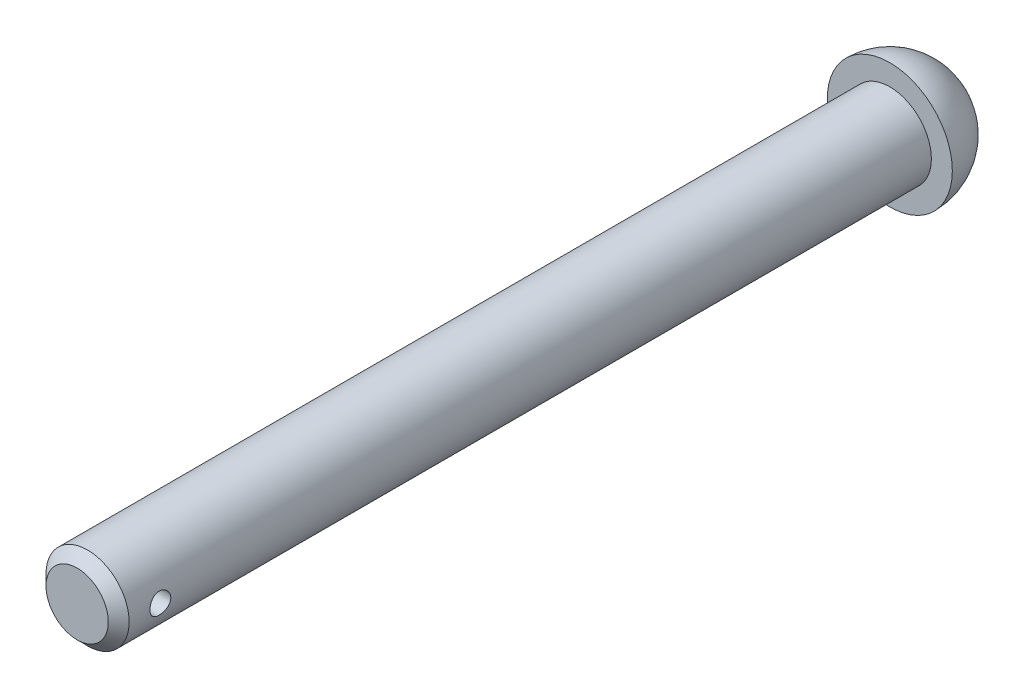
ISO-10303-21;
HEADER;
FILE_DESCRIPTION(('STEP AP214'),'2;1');
FILE_NAME('part.step','',(''),(''),'','','');
FILE_SCHEMA(('AUTOMOTIVE_DESIGN { 1 0 10303 214 1 1 1 1 }'));
ENDSEC;
DATA;
#1=APPLICATION_CONTEXT('core data for automotive mechanical design processes');
#2=APPLICATION_PROTOCOL_DEFINITION('international standard','automotive_design',2000,#1);
#3=PRODUCT_CONTEXT('',#1,'mechanical');
#4=PRODUCT('Part','Part','',(#3));
#5=PRODUCT_RELATED_PRODUCT_CATEGORY('part','',(#4));
#6=PRODUCT_DEFINITION_FORMATION('','',#4);
#7=PRODUCT_DEFINITION_CONTEXT('part definition',#1,'design');
#8=PRODUCT_DEFINITION('design','',#6,#7);
#9=PRODUCT_DEFINITION_SHAPE('','',#8);
#10=(LENGTH_UNIT() NAMED_UNIT(*) SI_UNIT(.MILLI.,.METRE.));
#11=(NAMED_UNIT(*) PLANE_ANGLE_UNIT() SI_UNIT($,.RADIAN.));
#12=(NAMED_UNIT(*) SI_UNIT($,.STERADIAN.) SOLID_ANGLE_UNIT());
#13=UNCERTAINTY_MEASURE_WITH_UNIT(LENGTH_MEASURE(1.E-05),#10,'distance_accuracy_value','');
#14=(GEOMETRIC_REPRESENTATION_CONTEXT(3) GLOBAL_UNCERTAINTY_ASSIGNED_CONTEXT((#13)) GLOBAL_UNIT_ASSIGNED_CONTEXT((#10,
#11,#12)) REPRESENTATION_CONTEXT('',''));
#15=CARTESIAN_POINT('',(0.,0.,0.));
#16=DIRECTION('',(0.,0.,1.));
#17=DIRECTION('',(1.,0.,0.));
#18=AXIS2_PLACEMENT_3D('',#15,#16,#17);
#19=CARTESIAN_POINT('',(0.,1.9945945945946,0.));
#20=DIRECTION('',(0.,0.,-1.));
#21=DIRECTION('',(-1.,0.,0.));
#22=AXIS2_PLACEMENT_3D('',#19,#20,#21);
#23=PLANE('',#22);
#24=CARTESIAN_POINT('',(0.,0.,0.));
#25=DIRECTION('',(0.,0.,-1.));
#26=DIRECTION('',(-1.,0.,0.));
#27=AXIS2_PLACEMENT_3D('',#24,#25,#26);
#28=CIRCLE('',#27,1.49459459459459);
#29=CARTESIAN_POINT('',(-1.49459459459459,0.,0.));
#30=VERTEX_POINT('',#29);
#31=EDGE_CURVE('E38',#30,#30,#28,.F.);
#32=ORIENTED_EDGE('',*,*,#31,.T.);
#33=EDGE_LOOP('',(#32));
#34=FACE_BOUND('',#33,.T.);
#35=ADVANCED_FACE('F31',(#34),#23,.F.);
#36=CARTESIAN_POINT('',(0.,0.,0.));
#37=DIRECTION('',(0.,0.,1.));
#38=DIRECTION('',(1.,0.,0.));
#39=AXIS2_PLACEMENT_3D('',#36,#37,#38);
#40=CYLINDRICAL_SURFACE('',#39,1.9945945945946);
#41=CARTESIAN_POINT('',(0.,0.,-0.500000000000001));
#42=DIRECTION('',(0.,0.,-1.));
#43=DIRECTION('',(-1.,0.,0.));
#44=AXIS2_PLACEMENT_3D('',#41,#42,#43);
#45=CIRCLE('',#44,1.9945945945946);
#46=CARTESIAN_POINT('',(-1.9945945945946,0.,-0.500000000000001));
#47=VERTEX_POINT('',#46);
#48=EDGE_CURVE('E10',#47,#47,#45,.T.);
#49=ORIENTED_EDGE('',*,*,#48,.T.);
#50=EDGE_LOOP('',(#49));
#51=FACE_BOUND('',#50,.T.);
#52=CARTESIAN_POINT('',(1.9945945945946,0.,-2.50000000000001));
#53=CARTESIAN_POINT('',(1.99459412916602,-0.0276229243003891,-2.49999922923164));
#54=CARTESIAN_POINT('',(1.9940150601518,-0.0552544440206031,-2.49770322284521));
#55=CARTESIAN_POINT('',(1.99176115519341,-0.109725403131875,-2.4885937156492));
#56=CARTESIAN_POINT('',(1.9900857019167,-0.136564387372876,-2.48177766974727));
#57=CARTESIAN_POINT('',(1.98582453446624,-0.188655814007178,-2.46386064468975));
#58=CARTESIAN_POINT('',(1.98323991692116,-0.213910124770515,-2.45276482622166));
#59=CARTESIAN_POINT('',(1.97743560069731,-0.262198929308613,-2.42662141920469));
#60=CARTESIAN_POINT('',(1.97421587975519,-0.285233345223514,-2.41157369211677));
#61=CARTESIAN_POINT('',(1.96741630806606,-0.328905296646371,-2.37762462668088));
#62=CARTESIAN_POINT('',(1.96383087704529,-0.349490338649994,-2.35865687525255));
#63=CARTESIAN_POINT('',(1.95674100959017,-0.387222949714277,-2.31754836783185));
#64=CARTESIAN_POINT('',(1.95323658238955,-0.404370128580711,-2.29540725215413));
#65=CARTESIAN_POINT('',(1.94664921340626,-0.434987510122619,-2.24817247724769));
#66=CARTESIAN_POINT('',(1.94357335408304,-0.44839892545552,-2.22303963477457));
#67=CARTESIAN_POINT('',(1.93827278632662,-0.470786001715847,-2.17078655756022));
#68=CARTESIAN_POINT('',(1.93604794101707,-0.479762376039138,-2.14366664325468));
#69=CARTESIAN_POINT('',(1.93275866869361,-0.492845357985552,-2.08878663398759));
#70=CARTESIAN_POINT('',(1.93167177822492,-0.49704638096564,-2.06105042465896));
#71=CARTESIAN_POINT('',(1.93071424252683,-0.500753507696852,-2.00524725457057));
#72=CARTESIAN_POINT('',(1.93084339828345,-0.500260379676538,-1.97718034868236));
#73=CARTESIAN_POINT('',(1.93228317323515,-0.494668517696636,-1.9222366487033));
#74=CARTESIAN_POINT('',(1.93356491201462,-0.48968235983675,-1.89534752215308));
#75=CARTESIAN_POINT('',(1.93711939899412,-0.47542558911305,-1.84280013988248));
#76=CARTESIAN_POINT('',(1.93939221813484,-0.466154669546769,-1.81714197241908));
#77=CARTESIAN_POINT('',(1.94469924078358,-0.443495771600234,-1.76748331336249));
#78=CARTESIAN_POINT('',(1.94774093251608,-0.430066991360872,-1.74350227326373));
#79=CARTESIAN_POINT('',(1.95423875875304,-0.399502099243961,-1.69809364006625));
#80=CARTESIAN_POINT('',(1.95769496609402,-0.382365335392258,-1.67666649704768));
#81=CARTESIAN_POINT('',(1.96475394163776,-0.344288093247245,-1.63632884427759));
#82=CARTESIAN_POINT('',(1.96835807057655,-0.323252633655316,-1.61750811835391));
#83=CARTESIAN_POINT('',(1.9752174434422,-0.278280867045495,-1.5836443069893));
#84=CARTESIAN_POINT('',(1.97847267659617,-0.254344470503571,-1.56860133817546));
#85=CARTESIAN_POINT('',(1.98428382703446,-0.204121757216062,-1.54268682653742));
#86=CARTESIAN_POINT('',(1.98683727954726,-0.177827577640995,-1.53182993347024));
#87=CARTESIAN_POINT('',(1.99093924187059,-0.12370904259099,-1.51471547044262));
#88=CARTESIAN_POINT('',(1.9924879449804,-0.0958849825609624,-1.50845701577826));
#89=CARTESIAN_POINT('',(1.99437728203376,-0.0402640921406006,-1.50085435538753));
#90=CARTESIAN_POINT('',(1.99474796435106,-0.0124849691870178,-1.49938788984704));
#91=CARTESIAN_POINT('',(1.99432510926712,0.0429217973701125,-1.50107541772257));
#92=CARTESIAN_POINT('',(1.99353167727241,0.0705494544610229,-1.50422899280981));
#93=CARTESIAN_POINT('',(1.99088900641486,0.124443740657923,-1.51496632880956));
#94=CARTESIAN_POINT('',(1.98905568647708,0.15072452106727,-1.52248333266533));
#95=CARTESIAN_POINT('',(1.98453993017485,0.201650652157164,-1.54165784393325));
#96=CARTESIAN_POINT('',(1.98185740779231,0.226295836857633,-1.55331577080561));
#97=CARTESIAN_POINT('',(1.97586890691978,0.273737166379977,-1.58067774464301));
#98=CARTESIAN_POINT('',(1.97255267034549,0.29649253549461,-1.59645019103822));
#99=CARTESIAN_POINT('',(1.96568067237855,0.33907691453299,-1.6315061092407));
#100=CARTESIAN_POINT('',(1.9621248694796,0.358905415450493,-1.65079019045044));
#101=CARTESIAN_POINT('',(1.95506624210939,0.395577470306682,-1.69288974284238));
#102=CARTESIAN_POINT('',(1.95156689306674,0.412335242210465,-1.71578064614613));
#103=CARTESIAN_POINT('',(1.94511527229302,0.441771595189007,-1.7641217569349));
#104=CARTESIAN_POINT('',(1.9421629763113,0.454450357103006,-1.78957185089483));
#105=CARTESIAN_POINT('',(1.93717232977737,0.475274314480221,-1.84217271289303));
#106=CARTESIAN_POINT('',(1.93512857976061,0.483446365000588,-1.86931231025619));
#107=CARTESIAN_POINT('',(1.93218138002976,0.495095440547508,-1.92463930958524));
#108=CARTESIAN_POINT('',(1.93127767932133,0.498573499019603,-1.95282647950926));
#109=CARTESIAN_POINT('',(1.93073210310839,0.500681643389609,-2.00857536485468));
#110=CARTESIAN_POINT('',(1.93105453279858,0.499448864848939,-2.03613162794188));
#111=CARTESIAN_POINT('',(1.93284231857926,0.492484354546481,-2.09062991300037));
#112=CARTESIAN_POINT('',(1.93430765145904,0.486752714150017,-2.11757194743432));
#113=CARTESIAN_POINT('',(1.93819618877685,0.47102826572168,-2.16992695535936));
#114=CARTESIAN_POINT('',(1.94061357526406,0.461061310799122,-2.19534815550514));
#115=CARTESIAN_POINT('',(1.94613463133654,0.437169598358069,-2.24417571632294));
#116=CARTESIAN_POINT('',(1.94923839660508,0.423244288955783,-2.26758179544841));
#117=CARTESIAN_POINT('',(1.95588417437892,0.391401788504877,-2.31237705921779));
#118=CARTESIAN_POINT('',(1.95943554379176,0.373389505375761,-2.33369727103976));
#119=CARTESIAN_POINT('',(1.96652066493811,0.334069492676488,-2.37305711779535));
#120=CARTESIAN_POINT('',(1.97005441228448,0.312760981008558,-2.39109597194361));
#121=CARTESIAN_POINT('',(1.97678303683404,0.266984383956085,-2.42370189770922));
#122=CARTESIAN_POINT('',(1.97997055913109,0.242465766173402,-2.43819965801994));
#123=CARTESIAN_POINT('',(1.98556988135218,0.191261574034837,-2.46284451169936));
#124=CARTESIAN_POINT('',(1.98798223455119,0.164577562338431,-2.47299470986001));
#125=CARTESIAN_POINT('',(1.99140453947636,0.114952672366669,-2.48715684519178));
#126=CARTESIAN_POINT('',(1.99259257329145,0.0922473260885578,-2.49196258750016));
#127=CARTESIAN_POINT('',(1.99418776647771,0.0463633141908546,-2.49838436706433));
#128=CARTESIAN_POINT('',(1.99459498524167,0.023184684707163,-2.50000064692722));
#129=CARTESIAN_POINT('',(1.9945945945946,0.,-2.50000000000001));
#130=B_SPLINE_CURVE_WITH_KNOTS('',3,(#52,#53,#54,#55,#56,#57,#58,#59,#60,#61,#62,#63,#64,#65,
#66,#67,#68,#69,#70,#71,#72,#73,#74,#75,#76,#77,#78,#79,#80,#81,#82,#83,#84,#85,#86,#87,#88,#89,
#90,#91,#92,#93,#94,#95,#96,#97,#98,#99,#100,#101,#102,#103,#104,#105,#106,#107,#108,#109,#110,
#111,#112,#113,#114,#115,#116,#117,#118,#119,#120,#121,#122,#123,#124,#125,#126,#127,#128,#129),
.UNSPECIFIED.,.T.,.F.,(4,2,2,2,2,2,2,2,2,2,2,2,2,2,2,2,2,2,2,2,2,2,2,2,2,2,2,2,2,2,2,2,2,2,2,2,
2,2,4),(0.,0.0827838071128275,0.165614266812049,0.248345157560955,0.331078948930654,
0.415350127651107,0.49963086566302,0.585171281079084,0.670697932459611,0.754502470752652,
0.838293294119821,0.920041327631844,1.00179521355979,1.08437825274479,1.16697582430877,
1.25194189843887,1.33691059532274,1.42217400994035,1.50742101623923,1.59047536902927,
1.67352220199785,1.7553307714284,1.83714763012937,1.92042245562462,2.0037117462716,
2.0890573721243,2.17439921373385,2.25922685971629,2.3440358267022,2.42639501790788,
2.50875253656175,2.59061439298552,2.67248766839913,2.75650762174471,2.84054754121073,
2.92612003358533,3.01163131244361,3.08111933825229,3.15060207823657),.UNSPECIFIED.);
#131=CARTESIAN_POINT('',(1.9945945945946,0.,-2.50000000000001));
#132=VERTEX_POINT('',#131);
#133=EDGE_CURVE('E49',#132,#132,#130,.T.);
#134=ORIENTED_EDGE('',*,*,#133,.T.);
#135=EDGE_LOOP('',(#134));
#136=FACE_BOUND('',#135,.T.);
#137=CARTESIAN_POINT('',(-1.9945945945946,0.,-2.50000000000001));
#138=CARTESIAN_POINT('',(-1.99459412916602,0.0276229243003891,-2.49999922923164));
#139=CARTESIAN_POINT('',(-1.9940150601518,0.0552544440206031,-2.49770322284521));
#140=CARTESIAN_POINT('',(-1.99176115519341,0.109725403131875,-2.4885937156492));
#141=CARTESIAN_POINT('',(-1.9900857019167,0.136564387372876,-2.48177766974727));
#142=CARTESIAN_POINT('',(-1.98582453446624,0.188655814007178,-2.46386064468975));
#143=CARTESIAN_POINT('',(-1.98323991692116,0.213910124770515,-2.45276482622166));
#144=CARTESIAN_POINT('',(-1.97743560069731,0.262198929308613,-2.42662141920469));
#145=CARTESIAN_POINT('',(-1.97421587975519,0.285233345223514,-2.41157369211677));
#146=CARTESIAN_POINT('',(-1.96741630806606,0.328905296646371,-2.37762462668088));
#147=CARTESIAN_POINT('',(-1.96383087704529,0.349490338649994,-2.35865687525255));
#148=CARTESIAN_POINT('',(-1.95674100959017,0.387222949714277,-2.31754836783185));
#149=CARTESIAN_POINT('',(-1.95323658238955,0.404370128580711,-2.29540725215413));
#150=CARTESIAN_POINT('',(-1.94664921340626,0.434987510122619,-2.24817247724769));
#151=CARTESIAN_POINT('',(-1.94357335408304,0.44839892545552,-2.22303963477457));
#152=CARTESIAN_POINT('',(-1.93827278632662,0.470786001715847,-2.17078655756022));
#153=CARTESIAN_POINT('',(-1.93604794101707,0.479762376039138,-2.14366664325468));
#154=CARTESIAN_POINT('',(-1.93275866869361,0.492845357985552,-2.08878663398759));
#155=CARTESIAN_POINT('',(-1.93167177822492,0.49704638096564,-2.06105042465896));
#156=CARTESIAN_POINT('',(-1.93071424252683,0.500753507696852,-2.00524725457057));
#157=CARTESIAN_POINT('',(-1.93084339828345,0.500260379676538,-1.97718034868236));
#158=CARTESIAN_POINT('',(-1.93228317323515,0.494668517696636,-1.9222366487033));
#159=CARTESIAN_POINT('',(-1.93356491201462,0.48968235983675,-1.89534752215308));
#160=CARTESIAN_POINT('',(-1.93711939899412,0.47542558911305,-1.84280013988248));
#161=CARTESIAN_POINT('',(-1.93939221813484,0.466154669546769,-1.81714197241908));
#162=CARTESIAN_POINT('',(-1.94469924078358,0.443495771600234,-1.76748331336249));
#163=CARTESIAN_POINT('',(-1.94774093251608,0.430066991360872,-1.74350227326373));
#164=CARTESIAN_POINT('',(-1.95423875875304,0.399502099243961,-1.69809364006625));
#165=CARTESIAN_POINT('',(-1.95769496609402,0.382365335392258,-1.67666649704768));
#166=CARTESIAN_POINT('',(-1.96475394163776,0.344288093247245,-1.63632884427759));
#167=CARTESIAN_POINT('',(-1.96835807057655,0.323252633655316,-1.61750811835391));
#168=CARTESIAN_POINT('',(-1.9752174434422,0.278280867045495,-1.5836443069893));
#169=CARTESIAN_POINT('',(-1.97847267659617,0.254344470503571,-1.56860133817546));
#170=CARTESIAN_POINT('',(-1.98428382703446,0.204121757216062,-1.54268682653742));
#171=CARTESIAN_POINT('',(-1.98683727954726,0.177827577640995,-1.53182993347024));
#172=CARTESIAN_POINT('',(-1.99093924187059,0.12370904259099,-1.51471547044262));
#173=CARTESIAN_POINT('',(-1.9924879449804,0.0958849825609624,-1.50845701577826));
#174=CARTESIAN_POINT('',(-1.99437728203376,0.0402640921406006,-1.50085435538753));
#175=CARTESIAN_POINT('',(-1.99474796435106,0.0124849691870178,-1.49938788984704));
#176=CARTESIAN_POINT('',(-1.99432510926712,-0.0429217973701125,-1.50107541772257));
#177=CARTESIAN_POINT('',(-1.99353167727241,-0.0705494544610229,-1.50422899280981));
#178=CARTESIAN_POINT('',(-1.99088900641486,-0.124443740657923,-1.51496632880956));
#179=CARTESIAN_POINT('',(-1.98905568647708,-0.15072452106727,-1.52248333266533));
#180=CARTESIAN_POINT('',(-1.98453993017485,-0.201650652157164,-1.54165784393325));
#181=CARTESIAN_POINT('',(-1.98185740779231,-0.226295836857633,-1.55331577080561));
#182=CARTESIAN_POINT('',(-1.97586890691978,-0.273737166379977,-1.58067774464301));
#183=CARTESIAN_POINT('',(-1.97255267034549,-0.29649253549461,-1.59645019103822));
#184=CARTESIAN_POINT('',(-1.96568067237855,-0.33907691453299,-1.6315061092407));
#185=CARTESIAN_POINT('',(-1.9621248694796,-0.358905415450493,-1.65079019045044));
#186=CARTESIAN_POINT('',(-1.95506624210939,-0.395577470306682,-1.69288974284238));
#187=CARTESIAN_POINT('',(-1.95156689306674,-0.412335242210465,-1.71578064614613));
#188=CARTESIAN_POINT('',(-1.94511527229302,-0.441771595189007,-1.7641217569349));
#189=CARTESIAN_POINT('',(-1.9421629763113,-0.454450357103006,-1.78957185089483));
#190=CARTESIAN_POINT('',(-1.93717232977737,-0.475274314480221,-1.84217271289303));
#191=CARTESIAN_POINT('',(-1.93512857976061,-0.483446365000588,-1.86931231025619));
#192=CARTESIAN_POINT('',(-1.93218138002976,-0.495095440547508,-1.92463930958524));
#193=CARTESIAN_POINT('',(-1.93127767932133,-0.498573499019603,-1.95282647950926));
#194=CARTESIAN_POINT('',(-1.93073210310839,-0.500681643389609,-2.00857536485468));
#195=CARTESIAN_POINT('',(-1.93105453279858,-0.499448864848939,-2.03613162794188));
#196=CARTESIAN_POINT('',(-1.93284231857926,-0.492484354546481,-2.09062991300037));
#197=CARTESIAN_POINT('',(-1.93430765145904,-0.486752714150017,-2.11757194743432));
#198=CARTESIAN_POINT('',(-1.93819618877685,-0.47102826572168,-2.16992695535936));
#199=CARTESIAN_POINT('',(-1.94061357526406,-0.461061310799122,-2.19534815550514));
#200=CARTESIAN_POINT('',(-1.94613463133654,-0.437169598358069,-2.24417571632294));
#201=CARTESIAN_POINT('',(-1.94923839660508,-0.423244288955783,-2.26758179544841));
#202=CARTESIAN_POINT('',(-1.95588417437892,-0.391401788504877,-2.31237705921779));
#203=CARTESIAN_POINT('',(-1.95943554379176,-0.373389505375761,-2.33369727103976));
#204=CARTESIAN_POINT('',(-1.96652066493811,-0.334069492676488,-2.37305711779535));
#205=CARTESIAN_POINT('',(-1.97005441228448,-0.312760981008558,-2.39109597194361));
#206=CARTESIAN_POINT('',(-1.97678303683404,-0.266984383956085,-2.42370189770922));
#207=CARTESIAN_POINT('',(-1.97997055913109,-0.242465766173402,-2.43819965801994));
#208=CARTESIAN_POINT('',(-1.98556988135218,-0.191261574034837,-2.46284451169936));
#209=CARTESIAN_POINT('',(-1.98798223455119,-0.164577562338431,-2.47299470986001));
#210=CARTESIAN_POINT('',(-1.99140453947636,-0.114952672366669,-2.48715684519178));
#211=CARTESIAN_POINT('',(-1.99259257329145,-0.0922473260885578,-2.49196258750016));
#212=CARTESIAN_POINT('',(-1.99418776647771,-0.0463633141908546,-2.49838436706433));
#213=CARTESIAN_POINT('',(-1.99459498524167,-0.023184684707163,-2.50000064692722));
#214=CARTESIAN_POINT('',(-1.9945945945946,0.,-2.50000000000001));
#215=B_SPLINE_CURVE_WITH_KNOTS('',3,(#137,#138,#139,#140,#141,#142,#143,#144,#145,#146,#147,
#148,#149,#150,#151,#152,#153,#154,#155,#156,#157,#158,#159,#160,#161,#162,#163,#164,#165,#166,
#167,#168,#169,#170,#171,#172,#173,#174,#175,#176,#177,#178,#179,#180,#181,#182,#183,#184,#185,
#186,#187,#188,#189,#190,#191,#192,#193,#194,#195,#196,#197,#198,#199,#200,#201,#202,#203,#204,
#205,#206,#207,#208,#209,#210,#211,#212,#213,#214),.UNSPECIFIED.,.T.,.F.,(4,2,2,2,2,2,2,2,2,2,2,
2,2,2,2,2,2,2,2,2,2,2,2,2,2,2,2,2,2,2,2,2,2,2,2,2,2,2,4),(0.,0.0827838071128275,
0.165614266812049,0.248345157560955,0.331078948930654,0.415350127651107,0.49963086566302,
0.585171281079084,0.670697932459611,0.754502470752652,0.838293294119821,0.920041327631844,
1.00179521355979,1.08437825274479,1.16697582430877,1.25194189843887,1.33691059532274,
1.42217400994035,1.50742101623923,1.59047536902927,1.67352220199785,1.7553307714284,
1.83714763012937,1.92042245562462,2.0037117462716,2.0890573721243,2.17439921373385,
2.25922685971629,2.3440358267022,2.42639501790788,2.50875253656175,2.59061439298552,
2.67248766839913,2.75650762174471,2.84054754121073,2.92612003358533,3.01163131244361,
3.08111933825229,3.15060207823657),.UNSPECIFIED.);
#216=CARTESIAN_POINT('',(-1.9945945945946,0.,-2.50000000000001));
#217=VERTEX_POINT('',#216);
#218=EDGE_CURVE('E56',#217,#217,#215,.T.);
#219=ORIENTED_EDGE('',*,*,#218,.T.);
#220=EDGE_LOOP('',(#219));
#221=FACE_BOUND('',#220,.T.);
#222=CARTESIAN_POINT('',(0.,0.,-39.));
#223=DIRECTION('',(0.,0.,1.));
#224=DIRECTION('',(1.,0.,0.));
#225=AXIS2_PLACEMENT_3D('',#222,#223,#224);
#226=CIRCLE('',#225,1.9945945945946);
#227=CARTESIAN_POINT('',(1.9945945945946,0.,-39.));
#228=VERTEX_POINT('',#227);
#229=EDGE_CURVE('E42',#228,#228,#226,.T.);
#230=ORIENTED_EDGE('',*,*,#229,.T.);
#231=EDGE_LOOP('',(#230));
#232=FACE_BOUND('',#231,.T.);
#233=ADVANCED_FACE('F59',(#51,#136,#221,#232),#40,.T.);
#234=CARTESIAN_POINT('',(0.,1.9945945945946,-39.));
#235=DIRECTION('',(0.,0.,-1.));
#236=DIRECTION('',(-1.,0.,0.));
#237=AXIS2_PLACEMENT_3D('',#234,#235,#236);
#238=PLANE('',#237);
#239=ORIENTED_EDGE('',*,*,#229,.F.);
#240=EDGE_LOOP('',(#239));
#241=FACE_BOUND('',#240,.T.);
#242=CARTESIAN_POINT('',(0.,0.,-39.));
#243=DIRECTION('',(0.,0.,1.));
#244=DIRECTION('',(1.,0.,0.));
#245=AXIS2_PLACEMENT_3D('',#242,#243,#244);
#246=CIRCLE('',#245,3.);
#247=CARTESIAN_POINT('',(3.,0.,-39.));
#248=VERTEX_POINT('',#247);
#249=EDGE_CURVE('E46',#248,#248,#246,.T.);
#250=ORIENTED_EDGE('',*,*,#249,.T.);
#251=EDGE_LOOP('',(#250));
#252=FACE_BOUND('',#251,.T.);
#253=ADVANCED_FACE('F70',(#241,#252),#238,.F.);
#254=CARTESIAN_POINT('',(0.,0.,-39.));
#255=DIRECTION('',(0.,0.,1.));
#256=DIRECTION('',(0.,1.,0.));
#257=AXIS2_PLACEMENT_3D('',#254,#255,#256);
#258=SPHERICAL_SURFACE('',#257,3.);
#259=ORIENTED_EDGE('',*,*,#249,.F.);
#260=EDGE_LOOP('',(#259));
#261=FACE_BOUND('',#260,.T.);
#262=ADVANCED_FACE('F66',(#261),#258,.T.);
#263=CARTESIAN_POINT('',(-5.,0.,-2.00000000000001));
#264=DIRECTION('',(1.,0.,0.));
#265=DIRECTION('',(0.,0.,-1.));
#266=AXIS2_PLACEMENT_3D('',#263,#264,#265);
#267=CYLINDRICAL_SURFACE('',#266,0.5);
#268=ORIENTED_EDGE('',*,*,#218,.F.);
#269=EDGE_LOOP('',(#268));
#270=FACE_BOUND('',#269,.T.);
#271=ORIENTED_EDGE('',*,*,#133,.F.);
#272=EDGE_LOOP('',(#271));
#273=FACE_BOUND('',#272,.T.);
#274=ADVANCED_FACE('F62',(#270,#273),#267,.F.);
#275=CARTESIAN_POINT('',(0.,0.,0.));
#276=DIRECTION('',(0.,0.,-1.));
#277=DIRECTION('',(-1.,0.,0.));
#278=AXIS2_PLACEMENT_3D('',#275,#276,#277);
#279=CONICAL_SURFACE('',#278,1.49459459459459,0.785398163397448);
#280=ORIENTED_EDGE('',*,*,#48,.F.);
#281=EDGE_LOOP('',(#280));
#282=FACE_BOUND('',#281,.T.);
#283=ORIENTED_EDGE('',*,*,#31,.F.);
#284=EDGE_LOOP('',(#283));
#285=FACE_BOUND('',#284,.T.);
#286=ADVANCED_FACE('F33',(#282,#285),#279,.T.);
#287=CLOSED_SHELL('',(#35,#233,#253,#262,#274,#286));
#288=MANIFOLD_SOLID_BREP('B2',#287);
#289=ADVANCED_BREP_SHAPE_REPRESENTATION('',(#18,#288),#14);
#290=SHAPE_DEFINITION_REPRESENTATION(#9,#289);
ENDSEC;
END-ISO-10303-21;
